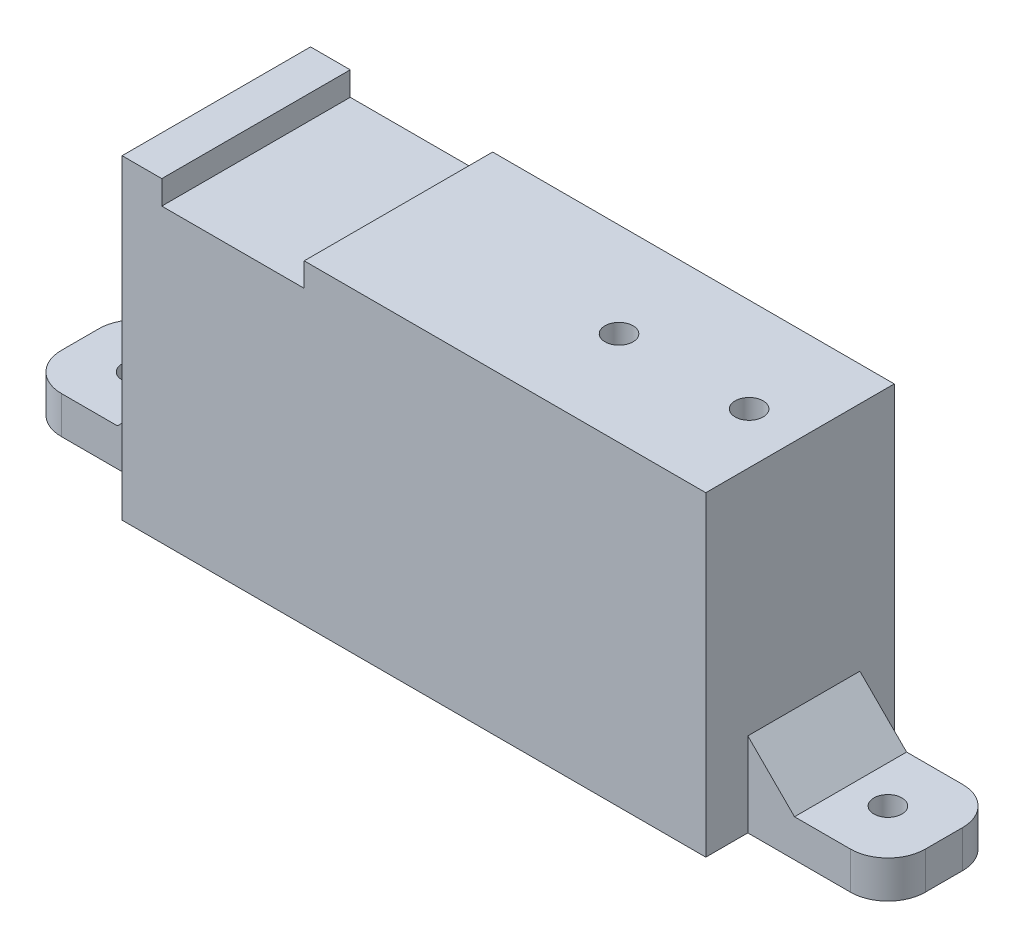
ISO-10303-21;
HEADER;
FILE_DESCRIPTION(('STEP AP214'),'2;1');
FILE_NAME('part.step','',(''),(''),'','','');
FILE_SCHEMA(('AUTOMOTIVE_DESIGN { 1 0 10303 214 1 1 1 1 }'));
ENDSEC;
DATA;
#1=APPLICATION_CONTEXT('core data for automotive mechanical design processes');
#2=APPLICATION_PROTOCOL_DEFINITION('international standard','automotive_design',2000,#1);
#3=PRODUCT_CONTEXT('',#1,'mechanical');
#4=PRODUCT('Part','Part','',(#3));
#5=PRODUCT_RELATED_PRODUCT_CATEGORY('part','',(#4));
#6=PRODUCT_DEFINITION_FORMATION('','',#4);
#7=PRODUCT_DEFINITION_CONTEXT('part definition',#1,'design');
#8=PRODUCT_DEFINITION('design','',#6,#7);
#9=PRODUCT_DEFINITION_SHAPE('','',#8);
#10=(LENGTH_UNIT() NAMED_UNIT(*) SI_UNIT(.MILLI.,.METRE.));
#11=(NAMED_UNIT(*) PLANE_ANGLE_UNIT() SI_UNIT($,.RADIAN.));
#12=(NAMED_UNIT(*) SI_UNIT($,.STERADIAN.) SOLID_ANGLE_UNIT());
#13=UNCERTAINTY_MEASURE_WITH_UNIT(LENGTH_MEASURE(1.E-05),#10,'distance_accuracy_value','');
#14=(GEOMETRIC_REPRESENTATION_CONTEXT(3) GLOBAL_UNCERTAINTY_ASSIGNED_CONTEXT((#13)) GLOBAL_UNIT_ASSIGNED_CONTEXT((#10,
#11,#12)) REPRESENTATION_CONTEXT('',''));
#15=CARTESIAN_POINT('',(0.,0.,0.));
#16=DIRECTION('',(0.,0.,1.));
#17=DIRECTION('',(1.,0.,0.));
#18=AXIS2_PLACEMENT_3D('',#15,#16,#17);
#19=CARTESIAN_POINT('',(31.25,33.8,10.09));
#20=DIRECTION('',(-1.,0.,0.));
#21=DIRECTION('',(0.,0.,1.));
#22=AXIS2_PLACEMENT_3D('',#19,#20,#21);
#23=PLANE('',#22);
#24=DIRECTION('',(0.,0.,-1.));
#25=VECTOR('',#24,1.);
#26=CARTESIAN_POINT('',(31.25,9.00000000000005,-6.41));
#27=LINE('',#26,#25);
#28=CARTESIAN_POINT('',(31.25,9.00000000000005,5.59));
#29=VERTEX_POINT('',#28);
#30=CARTESIAN_POINT('',(31.25,9.00000000000005,-6.41));
#31=VERTEX_POINT('',#30);
#32=EDGE_CURVE('E451',#29,#31,#27,.T.);
#33=ORIENTED_EDGE('',*,*,#32,.T.);
#34=DIRECTION('',(0.,-1.,0.));
#35=VECTOR('',#34,1.);
#36=CARTESIAN_POINT('',(31.25,4.,-6.41));
#37=LINE('',#36,#35);
#38=CARTESIAN_POINT('',(31.25,0.,-6.41));
#39=VERTEX_POINT('',#38);
#40=EDGE_CURVE('E272',#31,#39,#37,.T.);
#41=ORIENTED_EDGE('',*,*,#40,.T.);
#42=DIRECTION('',(0.,0.,-1.));
#43=VECTOR('',#42,1.);
#44=CARTESIAN_POINT('',(31.25,0.,10.09));
#45=LINE('',#44,#43);
#46=CARTESIAN_POINT('',(31.25,0.,-10.09));
#47=VERTEX_POINT('',#46);
#48=EDGE_CURVE('E379',#39,#47,#45,.T.);
#49=ORIENTED_EDGE('',*,*,#48,.T.);
#50=DIRECTION('',(0.,-1.,0.));
#51=VECTOR('',#50,1.);
#52=CARTESIAN_POINT('',(31.25,33.8,-10.09));
#53=LINE('',#52,#51);
#54=CARTESIAN_POINT('',(31.25,33.8,-10.09));
#55=VERTEX_POINT('',#54);
#56=EDGE_CURVE('E434',#55,#47,#53,.T.);
#57=ORIENTED_EDGE('',*,*,#56,.F.);
#58=DIRECTION('',(0.,0.,-1.));
#59=VECTOR('',#58,1.);
#60=CARTESIAN_POINT('',(31.25,33.8,10.09));
#61=LINE('',#60,#59);
#62=CARTESIAN_POINT('',(31.25,33.8,10.09));
#63=VERTEX_POINT('',#62);
#64=EDGE_CURVE('E390',#63,#55,#61,.T.);
#65=ORIENTED_EDGE('',*,*,#64,.F.);
#66=DIRECTION('',(0.,-1.,0.));
#67=VECTOR('',#66,1.);
#68=CARTESIAN_POINT('',(31.25,33.8,10.09));
#69=LINE('',#68,#67);
#70=CARTESIAN_POINT('',(31.25,0.,10.09));
#71=VERTEX_POINT('',#70);
#72=EDGE_CURVE('E408',#63,#71,#69,.T.);
#73=ORIENTED_EDGE('',*,*,#72,.T.);
#74=CARTESIAN_POINT('',(31.25,0.,5.59));
#75=VERTEX_POINT('',#74);
#76=EDGE_CURVE('E409',#71,#75,#45,.T.);
#77=ORIENTED_EDGE('',*,*,#76,.T.);
#78=DIRECTION('',(0.,-1.,0.));
#79=VECTOR('',#78,1.);
#80=CARTESIAN_POINT('',(31.25,4.,5.59));
#81=LINE('',#80,#79);
#82=EDGE_CURVE('E289',#29,#75,#81,.T.);
#83=ORIENTED_EDGE('',*,*,#82,.F.);
#84=EDGE_LOOP('',(#33,#41,#49,#57,#65,#73,#77,#83));
#85=FACE_BOUND('',#84,.T.);
#86=ADVANCED_FACE('F47',(#85),#23,.F.);
#87=CARTESIAN_POINT('',(-31.25,33.8,10.09));
#88=DIRECTION('',(1.,0.,0.));
#89=DIRECTION('',(0.,0.,-1.));
#90=AXIS2_PLACEMENT_3D('',#87,#88,#89);
#91=PLANE('',#90);
#92=DIRECTION('',(0.,0.,1.));
#93=VECTOR('',#92,1.);
#94=CARTESIAN_POINT('',(-31.25,9.00000000000005,5.59));
#95=LINE('',#94,#93);
#96=CARTESIAN_POINT('',(-31.25,9.00000000000005,-6.41));
#97=VERTEX_POINT('',#96);
#98=CARTESIAN_POINT('',(-31.25,9.00000000000005,5.59));
#99=VERTEX_POINT('',#98);
#100=EDGE_CURVE('E438',#97,#99,#95,.T.);
#101=ORIENTED_EDGE('',*,*,#100,.T.);
#102=DIRECTION('',(0.,-1.,0.));
#103=VECTOR('',#102,1.);
#104=CARTESIAN_POINT('',(-31.25,4.,5.59));
#105=LINE('',#104,#103);
#106=CARTESIAN_POINT('',(-31.25,0.,5.59));
#107=VERTEX_POINT('',#106);
#108=EDGE_CURVE('E219',#99,#107,#105,.T.);
#109=ORIENTED_EDGE('',*,*,#108,.T.);
#110=DIRECTION('',(0.,0.,1.));
#111=VECTOR('',#110,1.);
#112=CARTESIAN_POINT('',(-31.25,0.,10.09));
#113=LINE('',#112,#111);
#114=CARTESIAN_POINT('',(-31.25,0.,10.09));
#115=VERTEX_POINT('',#114);
#116=EDGE_CURVE('E416',#107,#115,#113,.T.);
#117=ORIENTED_EDGE('',*,*,#116,.T.);
#118=DIRECTION('',(0.,-1.,0.));
#119=VECTOR('',#118,1.);
#120=CARTESIAN_POINT('',(-31.25,33.8,10.09));
#121=LINE('',#120,#119);
#122=CARTESIAN_POINT('',(-31.25,33.8,10.09));
#123=VERTEX_POINT('',#122);
#124=EDGE_CURVE('E426',#123,#115,#121,.T.);
#125=ORIENTED_EDGE('',*,*,#124,.F.);
#126=DIRECTION('',(0.,0.,1.));
#127=VECTOR('',#126,1.);
#128=CARTESIAN_POINT('',(-31.25,33.8,10.09));
#129=LINE('',#128,#127);
#130=CARTESIAN_POINT('',(-31.25,33.8,-10.09));
#131=VERTEX_POINT('',#130);
#132=EDGE_CURVE('E400',#131,#123,#129,.T.);
#133=ORIENTED_EDGE('',*,*,#132,.F.);
#134=DIRECTION('',(0.,-1.,0.));
#135=VECTOR('',#134,1.);
#136=CARTESIAN_POINT('',(-31.25,33.8,-10.09));
#137=LINE('',#136,#135);
#138=CARTESIAN_POINT('',(-31.25,0.,-10.09));
#139=VERTEX_POINT('',#138);
#140=EDGE_CURVE('E430',#131,#139,#137,.T.);
#141=ORIENTED_EDGE('',*,*,#140,.T.);
#142=CARTESIAN_POINT('',(-31.25,0.,-6.41));
#143=VERTEX_POINT('',#142);
#144=EDGE_CURVE('E417',#139,#143,#113,.T.);
#145=ORIENTED_EDGE('',*,*,#144,.T.);
#146=DIRECTION('',(0.,-1.,0.));
#147=VECTOR('',#146,1.);
#148=CARTESIAN_POINT('',(-31.25,4.,-6.41));
#149=LINE('',#148,#147);
#150=EDGE_CURVE('E257',#97,#143,#149,.T.);
#151=ORIENTED_EDGE('',*,*,#150,.F.);
#152=EDGE_LOOP('',(#101,#109,#117,#125,#133,#141,#145,#151));
#153=FACE_BOUND('',#152,.T.);
#154=ADVANCED_FACE('F500',(#153),#91,.F.);
#155=CARTESIAN_POINT('',(0.,33.8,0.));
#156=DIRECTION('',(0.,-1.,0.));
#157=DIRECTION('',(0.,0.,-1.));
#158=AXIS2_PLACEMENT_3D('',#155,#156,#157);
#159=PLANE('',#158);
#160=DIRECTION('',(1.,0.,0.));
#161=VECTOR('',#160,1.);
#162=CARTESIAN_POINT('',(-31.25,33.8,10.09));
#163=LINE('',#162,#161);
#164=CARTESIAN_POINT('',(-27.,33.8,10.09));
#165=VERTEX_POINT('',#164);
#166=EDGE_CURVE('E404',#123,#165,#163,.T.);
#167=ORIENTED_EDGE('',*,*,#166,.T.);
#168=DIRECTION('',(0.,0.,1.));
#169=VECTOR('',#168,1.);
#170=CARTESIAN_POINT('',(-27.,33.8,-10.09));
#171=LINE('',#170,#169);
#172=CARTESIAN_POINT('',(-27.,33.8,-10.09));
#173=VERTEX_POINT('',#172);
#174=EDGE_CURVE('E342',#173,#165,#171,.T.);
#175=ORIENTED_EDGE('',*,*,#174,.F.);
#176=DIRECTION('',(-1.,0.,0.));
#177=VECTOR('',#176,1.);
#178=CARTESIAN_POINT('',(-31.25,33.8,-10.09));
#179=LINE('',#178,#177);
#180=EDGE_CURVE('E394',#173,#131,#179,.T.);
#181=ORIENTED_EDGE('',*,*,#180,.T.);
#182=ORIENTED_EDGE('',*,*,#132,.T.);
#183=EDGE_LOOP('',(#167,#175,#181,#182));
#184=FACE_BOUND('',#183,.T.);
#185=ADVANCED_FACE('F506',(#184),#159,.F.);
#186=CARTESIAN_POINT('',(-31.25,33.8,-10.09));
#187=DIRECTION('',(0.,0.,1.));
#188=DIRECTION('',(1.,0.,0.));
#189=AXIS2_PLACEMENT_3D('',#186,#187,#188);
#190=PLANE('',#189);
#191=ORIENTED_EDGE('',*,*,#180,.F.);
#192=DIRECTION('',(0.,1.,0.));
#193=VECTOR('',#192,1.);
#194=CARTESIAN_POINT('',(-27.,31.25,-10.09));
#195=LINE('',#194,#193);
#196=CARTESIAN_POINT('',(-27.,31.25,-10.09));
#197=VERTEX_POINT('',#196);
#198=EDGE_CURVE('E376',#197,#173,#195,.T.);
#199=ORIENTED_EDGE('',*,*,#198,.F.);
#200=DIRECTION('',(-1.,0.,0.));
#201=VECTOR('',#200,1.);
#202=CARTESIAN_POINT('',(-27.,31.25,-10.09));
#203=LINE('',#202,#201);
#204=CARTESIAN_POINT('',(-11.75,31.25,-10.09));
#205=VERTEX_POINT('',#204);
#206=EDGE_CURVE('E367',#205,#197,#203,.T.);
#207=ORIENTED_EDGE('',*,*,#206,.F.);
#208=DIRECTION('',(0.,1.,0.));
#209=VECTOR('',#208,1.);
#210=CARTESIAN_POINT('',(-11.75,31.25,-10.09));
#211=LINE('',#210,#209);
#212=CARTESIAN_POINT('',(-11.75,33.8,-10.09));
#213=VERTEX_POINT('',#212);
#214=EDGE_CURVE('E380',#205,#213,#211,.T.);
#215=ORIENTED_EDGE('',*,*,#214,.T.);
#216=EDGE_CURVE('E396',#55,#213,#179,.T.);
#217=ORIENTED_EDGE('',*,*,#216,.F.);
#218=ORIENTED_EDGE('',*,*,#56,.T.);
#219=DIRECTION('',(-1.,0.,0.));
#220=VECTOR('',#219,1.);
#221=CARTESIAN_POINT('',(-31.25,0.,-10.09));
#222=LINE('',#221,#220);
#223=EDGE_CURVE('E413',#47,#139,#222,.T.);
#224=ORIENTED_EDGE('',*,*,#223,.T.);
#225=ORIENTED_EDGE('',*,*,#140,.F.);
#226=EDGE_LOOP('',(#191,#199,#207,#215,#217,#218,#224,#225));
#227=FACE_BOUND('',#226,.T.);
#228=ADVANCED_FACE('F474',(#227),#190,.F.);
#229=CARTESIAN_POINT('',(-31.25,33.8,10.09));
#230=DIRECTION('',(0.,0.,-1.));
#231=DIRECTION('',(-1.,0.,0.));
#232=AXIS2_PLACEMENT_3D('',#229,#230,#231);
#233=PLANE('',#232);
#234=DIRECTION('',(1.,0.,0.));
#235=VECTOR('',#234,1.);
#236=CARTESIAN_POINT('',(-27.,31.25,10.09));
#237=LINE('',#236,#235);
#238=CARTESIAN_POINT('',(-27.,31.25,10.09));
#239=VERTEX_POINT('',#238);
#240=CARTESIAN_POINT('',(-11.75,31.25,10.09));
#241=VERTEX_POINT('',#240);
#242=EDGE_CURVE('E358',#239,#241,#237,.T.);
#243=ORIENTED_EDGE('',*,*,#242,.F.);
#244=DIRECTION('',(0.,1.,0.));
#245=VECTOR('',#244,1.);
#246=CARTESIAN_POINT('',(-27.,31.25,10.09));
#247=LINE('',#246,#245);
#248=EDGE_CURVE('E371',#239,#165,#247,.T.);
#249=ORIENTED_EDGE('',*,*,#248,.T.);
#250=ORIENTED_EDGE('',*,*,#166,.F.);
#251=ORIENTED_EDGE('',*,*,#124,.T.);
#252=DIRECTION('',(1.,0.,0.));
#253=VECTOR('',#252,1.);
#254=CARTESIAN_POINT('',(-31.25,0.,10.09));
#255=LINE('',#254,#253);
#256=EDGE_CURVE('E395',#115,#71,#255,.T.);
#257=ORIENTED_EDGE('',*,*,#256,.T.);
#258=ORIENTED_EDGE('',*,*,#72,.F.);
#259=CARTESIAN_POINT('',(-11.75,33.8,10.09));
#260=VERTEX_POINT('',#259);
#261=EDGE_CURVE('E403',#260,#63,#163,.T.);
#262=ORIENTED_EDGE('',*,*,#261,.F.);
#263=DIRECTION('',(0.,1.,0.));
#264=VECTOR('',#263,1.);
#265=CARTESIAN_POINT('',(-11.75,31.25,10.09));
#266=LINE('',#265,#264);
#267=EDGE_CURVE('E384',#241,#260,#266,.T.);
#268=ORIENTED_EDGE('',*,*,#267,.F.);
#269=EDGE_LOOP('',(#243,#249,#250,#251,#257,#258,#262,#268));
#270=FACE_BOUND('',#269,.T.);
#271=ADVANCED_FACE('F516',(#270),#233,.F.);
#272=CARTESIAN_POINT('',(25.8,33.8,0.));
#273=DIRECTION('',(0.,1.,0.));
#274=DIRECTION('',(0.,0.,1.));
#275=AXIS2_PLACEMENT_3D('',#272,#273,#274);
#276=CIRCLE('',#275,1.5);
#277=CARTESIAN_POINT('',(25.8,33.8,1.5));
#278=VERTEX_POINT('',#277);
#279=EDGE_CURVE('E343',#278,#278,#276,.T.);
#280=ORIENTED_EDGE('',*,*,#279,.F.);
#281=EDGE_LOOP('',(#280));
#282=FACE_BOUND('',#281,.T.);
#283=CARTESIAN_POINT('',(11.87,33.8,0.));
#284=DIRECTION('',(0.,1.,0.));
#285=DIRECTION('',(0.,0.,1.));
#286=AXIS2_PLACEMENT_3D('',#283,#284,#285);
#287=CIRCLE('',#286,1.5);
#288=CARTESIAN_POINT('',(11.87,33.8,1.5));
#289=VERTEX_POINT('',#288);
#290=EDGE_CURVE('E347',#289,#289,#287,.T.);
#291=ORIENTED_EDGE('',*,*,#290,.F.);
#292=EDGE_LOOP('',(#291));
#293=FACE_BOUND('',#292,.T.);
#294=ORIENTED_EDGE('',*,*,#216,.T.);
#295=DIRECTION('',(0.,0.,-1.));
#296=VECTOR('',#295,1.);
#297=CARTESIAN_POINT('',(-11.75,33.8,-10.09));
#298=LINE('',#297,#296);
#299=EDGE_CURVE('E359',#260,#213,#298,.T.);
#300=ORIENTED_EDGE('',*,*,#299,.F.);
#301=ORIENTED_EDGE('',*,*,#261,.T.);
#302=ORIENTED_EDGE('',*,*,#64,.T.);
#303=EDGE_LOOP('',(#294,#300,#301,#302));
#304=FACE_BOUND('',#303,.T.);
#305=ADVANCED_FACE('F478',(#282,#293,#304),#159,.F.);
#306=CARTESIAN_POINT('',(0.,0.,0.));
#307=DIRECTION('',(0.,-1.,0.));
#308=DIRECTION('',(0.,0.,-1.));
#309=AXIS2_PLACEMENT_3D('',#306,#307,#308);
#310=PLANE('',#309);
#311=ORIENTED_EDGE('',*,*,#76,.F.);
#312=ORIENTED_EDGE('',*,*,#256,.F.);
#313=ORIENTED_EDGE('',*,*,#116,.F.);
#314=DIRECTION('',(-1.,0.,0.));
#315=VECTOR('',#314,1.);
#316=CARTESIAN_POINT('',(-31.25,0.,5.59));
#317=LINE('',#316,#315);
#318=CARTESIAN_POINT('',(-42.25,0.,5.59));
#319=VERTEX_POINT('',#318);
#320=EDGE_CURVE('E240',#107,#319,#317,.T.);
#321=ORIENTED_EDGE('',*,*,#320,.T.);
#322=CARTESIAN_POINT('',(-42.25,0.,1.59));
#323=DIRECTION('',(0.,-1.,0.));
#324=DIRECTION('',(0.,0.,1.));
#325=AXIS2_PLACEMENT_3D('',#322,#323,#324);
#326=CIRCLE('',#325,4.);
#327=CARTESIAN_POINT('',(-46.25,0.,1.58999999999997));
#328=VERTEX_POINT('',#327);
#329=EDGE_CURVE('E215',#319,#328,#326,.T.);
#330=ORIENTED_EDGE('',*,*,#329,.T.);
#331=DIRECTION('',(0.,0.,-1.));
#332=VECTOR('',#331,1.);
#333=CARTESIAN_POINT('',(-46.25,0.,1.58999999999997));
#334=LINE('',#333,#332);
#335=CARTESIAN_POINT('',(-46.25,0.,-2.40999999999997));
#336=VERTEX_POINT('',#335);
#337=EDGE_CURVE('E246',#328,#336,#334,.T.);
#338=ORIENTED_EDGE('',*,*,#337,.T.);
#339=CARTESIAN_POINT('',(-42.25,0.,-2.41));
#340=DIRECTION('',(0.,-1.,0.));
#341=DIRECTION('',(0.,0.,-1.));
#342=AXIS2_PLACEMENT_3D('',#339,#340,#341);
#343=CIRCLE('',#342,4.);
#344=CARTESIAN_POINT('',(-42.25,0.,-6.41));
#345=VERTEX_POINT('',#344);
#346=EDGE_CURVE('E250',#336,#345,#343,.T.);
#347=ORIENTED_EDGE('',*,*,#346,.T.);
#348=DIRECTION('',(1.,0.,0.));
#349=VECTOR('',#348,1.);
#350=CARTESIAN_POINT('',(-31.25,0.,-6.41));
#351=LINE('',#350,#349);
#352=EDGE_CURVE('E209',#345,#143,#351,.T.);
#353=ORIENTED_EDGE('',*,*,#352,.T.);
#354=ORIENTED_EDGE('',*,*,#144,.F.);
#355=ORIENTED_EDGE('',*,*,#223,.F.);
#356=ORIENTED_EDGE('',*,*,#48,.F.);
#357=DIRECTION('',(1.,0.,0.));
#358=VECTOR('',#357,1.);
#359=CARTESIAN_POINT('',(31.25,0.,-6.41));
#360=LINE('',#359,#358);
#361=CARTESIAN_POINT('',(42.25,0.,-6.41));
#362=VERTEX_POINT('',#361);
#363=EDGE_CURVE('E309',#39,#362,#360,.T.);
#364=ORIENTED_EDGE('',*,*,#363,.T.);
#365=CARTESIAN_POINT('',(42.25,0.,-2.41));
#366=DIRECTION('',(0.,-1.,0.));
#367=DIRECTION('',(0.,0.,-1.));
#368=AXIS2_PLACEMENT_3D('',#365,#366,#367);
#369=CIRCLE('',#368,4.);
#370=CARTESIAN_POINT('',(46.25,0.,-2.40999999999997));
#371=VERTEX_POINT('',#370);
#372=EDGE_CURVE('E305',#362,#371,#369,.T.);
#373=ORIENTED_EDGE('',*,*,#372,.T.);
#374=DIRECTION('',(0.,0.,1.));
#375=VECTOR('',#374,1.);
#376=CARTESIAN_POINT('',(46.25,0.,1.58999999999997));
#377=LINE('',#376,#375);
#378=CARTESIAN_POINT('',(46.25,0.,1.58999999999997));
#379=VERTEX_POINT('',#378);
#380=EDGE_CURVE('E301',#371,#379,#377,.T.);
#381=ORIENTED_EDGE('',*,*,#380,.T.);
#382=CARTESIAN_POINT('',(42.25,0.,1.59));
#383=DIRECTION('',(0.,-1.,0.));
#384=DIRECTION('',(0.,0.,-1.));
#385=AXIS2_PLACEMENT_3D('',#382,#383,#384);
#386=CIRCLE('',#385,4.);
#387=CARTESIAN_POINT('',(42.25,0.,5.59));
#388=VERTEX_POINT('',#387);
#389=EDGE_CURVE('E296',#379,#388,#386,.T.);
#390=ORIENTED_EDGE('',*,*,#389,.T.);
#391=DIRECTION('',(-1.,0.,0.));
#392=VECTOR('',#391,1.);
#393=CARTESIAN_POINT('',(31.25,0.,5.59));
#394=LINE('',#393,#392);
#395=EDGE_CURVE('E292',#388,#75,#394,.T.);
#396=ORIENTED_EDGE('',*,*,#395,.T.);
#397=EDGE_LOOP('',(#311,#312,#313,#321,#330,#338,#347,#353,#354,#355,#356,#364,#373,#381,#390,#396));
#398=FACE_BOUND('',#397,.T.);
#399=CARTESIAN_POINT('',(-40.25,0.,-0.41));
#400=DIRECTION('',(0.,-1.,0.));
#401=DIRECTION('',(0.,0.,-1.));
#402=AXIS2_PLACEMENT_3D('',#399,#400,#401);
#403=CIRCLE('',#402,1.5);
#404=CARTESIAN_POINT('',(-40.25,0.,-1.91));
#405=VERTEX_POINT('',#404);
#406=EDGE_CURVE('E334',#405,#405,#403,.T.);
#407=ORIENTED_EDGE('',*,*,#406,.F.);
#408=EDGE_LOOP('',(#407));
#409=FACE_BOUND('',#408,.T.);
#410=CARTESIAN_POINT('',(40.25,0.,-0.41));
#411=DIRECTION('',(0.,-1.,0.));
#412=DIRECTION('',(0.,0.,1.));
#413=AXIS2_PLACEMENT_3D('',#410,#411,#412);
#414=CIRCLE('',#413,1.5);
#415=CARTESIAN_POINT('',(40.25,0.,1.09));
#416=VERTEX_POINT('',#415);
#417=EDGE_CURVE('E330',#416,#416,#414,.T.);
#418=ORIENTED_EDGE('',*,*,#417,.F.);
#419=EDGE_LOOP('',(#418));
#420=FACE_BOUND('',#419,.T.);
#421=ADVANCED_FACE('F469',(#398,#409,#420),#310,.T.);
#422=CARTESIAN_POINT('',(-27.,31.25,-10.09));
#423=DIRECTION('',(-1.,0.,0.));
#424=DIRECTION('',(0.,0.,1.));
#425=AXIS2_PLACEMENT_3D('',#422,#423,#424);
#426=PLANE('',#425);
#427=ORIENTED_EDGE('',*,*,#174,.T.);
#428=ORIENTED_EDGE('',*,*,#248,.F.);
#429=DIRECTION('',(0.,0.,1.));
#430=VECTOR('',#429,1.);
#431=CARTESIAN_POINT('',(-27.,31.25,-10.09));
#432=LINE('',#431,#430);
#433=EDGE_CURVE('E354',#197,#239,#432,.T.);
#434=ORIENTED_EDGE('',*,*,#433,.F.);
#435=ORIENTED_EDGE('',*,*,#198,.T.);
#436=EDGE_LOOP('',(#427,#428,#434,#435));
#437=FACE_BOUND('',#436,.T.);
#438=ADVANCED_FACE('F522',(#437),#426,.F.);
#439=CARTESIAN_POINT('',(-11.75,31.25,-10.09));
#440=DIRECTION('',(1.,0.,0.));
#441=DIRECTION('',(0.,0.,-1.));
#442=AXIS2_PLACEMENT_3D('',#439,#440,#441);
#443=PLANE('',#442);
#444=ORIENTED_EDGE('',*,*,#299,.T.);
#445=ORIENTED_EDGE('',*,*,#214,.F.);
#446=DIRECTION('',(0.,0.,-1.));
#447=VECTOR('',#446,1.);
#448=CARTESIAN_POINT('',(-11.75,31.25,-10.09));
#449=LINE('',#448,#447);
#450=EDGE_CURVE('E363',#241,#205,#449,.T.);
#451=ORIENTED_EDGE('',*,*,#450,.F.);
#452=ORIENTED_EDGE('',*,*,#267,.T.);
#453=EDGE_LOOP('',(#444,#445,#451,#452));
#454=FACE_BOUND('',#453,.T.);
#455=ADVANCED_FACE('F528',(#454),#443,.F.);
#456=CARTESIAN_POINT('',(0.,31.25,0.));
#457=DIRECTION('',(0.,1.,0.));
#458=DIRECTION('',(0.,0.,1.));
#459=AXIS2_PLACEMENT_3D('',#456,#457,#458);
#460=PLANE('',#459);
#461=ORIENTED_EDGE('',*,*,#433,.T.);
#462=ORIENTED_EDGE('',*,*,#242,.T.);
#463=ORIENTED_EDGE('',*,*,#450,.T.);
#464=ORIENTED_EDGE('',*,*,#206,.T.);
#465=EDGE_LOOP('',(#461,#462,#463,#464));
#466=FACE_BOUND('',#465,.T.);
#467=ADVANCED_FACE('F532',(#466),#460,.T.);
#468=CARTESIAN_POINT('',(11.87,18.8,0.));
#469=DIRECTION('',(0.,1.,0.));
#470=DIRECTION('',(0.,0.,1.));
#471=AXIS2_PLACEMENT_3D('',#468,#469,#470);
#472=CYLINDRICAL_SURFACE('',#471,1.5);
#473=CARTESIAN_POINT('',(11.87,18.8,0.));
#474=DIRECTION('',(0.,1.,0.));
#475=DIRECTION('',(0.,0.,1.));
#476=AXIS2_PLACEMENT_3D('',#473,#474,#475);
#477=CIRCLE('',#476,1.5);
#478=CARTESIAN_POINT('',(11.87,18.8,1.5));
#479=VERTEX_POINT('',#478);
#480=EDGE_CURVE('E260',#479,#479,#477,.T.);
#481=ORIENTED_EDGE('',*,*,#480,.F.);
#482=EDGE_LOOP('',(#481));
#483=FACE_BOUND('',#482,.T.);
#484=ORIENTED_EDGE('',*,*,#290,.T.);
#485=EDGE_LOOP('',(#484));
#486=FACE_BOUND('',#485,.T.);
#487=ADVANCED_FACE('F536',(#483,#486),#472,.F.);
#488=CARTESIAN_POINT('',(11.87,18.8,0.));
#489=DIRECTION('',(0.,1.,0.));
#490=DIRECTION('',(0.,0.,1.));
#491=AXIS2_PLACEMENT_3D('',#488,#489,#490);
#492=PLANE('',#491);
#493=ORIENTED_EDGE('',*,*,#480,.T.);
#494=EDGE_LOOP('',(#493));
#495=FACE_BOUND('',#494,.T.);
#496=ADVANCED_FACE('F538',(#495),#492,.T.);
#497=CARTESIAN_POINT('',(25.8,18.8,0.));
#498=DIRECTION('',(0.,1.,0.));
#499=DIRECTION('',(0.,0.,1.));
#500=AXIS2_PLACEMENT_3D('',#497,#498,#499);
#501=CYLINDRICAL_SURFACE('',#500,1.5);
#502=CARTESIAN_POINT('',(25.8,18.8,0.));
#503=DIRECTION('',(0.,1.,0.));
#504=DIRECTION('',(0.,0.,1.));
#505=AXIS2_PLACEMENT_3D('',#502,#503,#504);
#506=CIRCLE('',#505,1.5);
#507=CARTESIAN_POINT('',(25.8,18.8,1.5));
#508=VERTEX_POINT('',#507);
#509=EDGE_CURVE('E338',#508,#508,#506,.T.);
#510=ORIENTED_EDGE('',*,*,#509,.F.);
#511=EDGE_LOOP('',(#510));
#512=FACE_BOUND('',#511,.T.);
#513=ORIENTED_EDGE('',*,*,#279,.T.);
#514=EDGE_LOOP('',(#513));
#515=FACE_BOUND('',#514,.T.);
#516=ADVANCED_FACE('F541',(#512,#515),#501,.F.);
#517=CARTESIAN_POINT('',(0.,18.8,0.));
#518=DIRECTION('',(0.,1.,0.));
#519=DIRECTION('',(0.,0.,1.));
#520=AXIS2_PLACEMENT_3D('',#517,#518,#519);
#521=PLANE('',#520);
#522=ORIENTED_EDGE('',*,*,#509,.T.);
#523=EDGE_LOOP('',(#522));
#524=FACE_BOUND('',#523,.T.);
#525=ADVANCED_FACE('F548',(#524),#521,.T.);
#526=CARTESIAN_POINT('',(-31.25,4.,-6.41));
#527=DIRECTION('',(0.,0.,-1.));
#528=DIRECTION('',(-1.,0.,0.));
#529=AXIS2_PLACEMENT_3D('',#526,#527,#528);
#530=PLANE('',#529);
#531=ORIENTED_EDGE('',*,*,#352,.F.);
#532=DIRECTION('',(0.,-1.,0.));
#533=VECTOR('',#532,1.);
#534=CARTESIAN_POINT('',(-42.25,4.,-6.41));
#535=LINE('',#534,#533);
#536=CARTESIAN_POINT('',(-42.25,4.,-6.41));
#537=VERTEX_POINT('',#536);
#538=EDGE_CURVE('E261',#537,#345,#535,.T.);
#539=ORIENTED_EDGE('',*,*,#538,.F.);
#540=DIRECTION('',(1.,0.,0.));
#541=VECTOR('',#540,1.);
#542=CARTESIAN_POINT('',(-31.25,4.,-6.41));
#543=LINE('',#542,#541);
#544=CARTESIAN_POINT('',(-36.25,4.,-6.41));
#545=VERTEX_POINT('',#544);
#546=EDGE_CURVE('E236',#537,#545,#543,.T.);
#547=ORIENTED_EDGE('',*,*,#546,.T.);
#548=DIRECTION('',(-0.707106781186544,-0.707106781186551,0.));
#549=VECTOR('',#548,1.);
#550=CARTESIAN_POINT('',(-31.25,9.00000000000005,-6.41));
#551=LINE('',#550,#549);
#552=EDGE_CURVE('E447',#545,#97,#551,.F.);
#553=ORIENTED_EDGE('',*,*,#552,.T.);
#554=ORIENTED_EDGE('',*,*,#150,.T.);
#555=EDGE_LOOP('',(#531,#539,#547,#553,#554));
#556=FACE_BOUND('',#555,.T.);
#557=ADVANCED_FACE('F552',(#556),#530,.T.);
#558=CARTESIAN_POINT('',(-42.25,4.,-2.41));
#559=DIRECTION('',(0.,-1.,0.));
#560=DIRECTION('',(0.,0.,-1.));
#561=AXIS2_PLACEMENT_3D('',#558,#559,#560);
#562=CYLINDRICAL_SURFACE('',#561,4.);
#563=ORIENTED_EDGE('',*,*,#346,.F.);
#564=DIRECTION('',(0.,-1.,0.));
#565=VECTOR('',#564,1.);
#566=CARTESIAN_POINT('',(-46.25,4.,-2.40999999999997));
#567=LINE('',#566,#565);
#568=CARTESIAN_POINT('',(-46.25,4.,-2.40999999999997));
#569=VERTEX_POINT('',#568);
#570=EDGE_CURVE('E264',#569,#336,#567,.T.);
#571=ORIENTED_EDGE('',*,*,#570,.F.);
#572=CARTESIAN_POINT('',(-42.25,4.,-2.41));
#573=DIRECTION('',(0.,-1.,0.));
#574=DIRECTION('',(0.,0.,-1.));
#575=AXIS2_PLACEMENT_3D('',#572,#573,#574);
#576=CIRCLE('',#575,4.);
#577=EDGE_CURVE('E229',#569,#537,#576,.T.);
#578=ORIENTED_EDGE('',*,*,#577,.T.);
#579=ORIENTED_EDGE('',*,*,#538,.T.);
#580=EDGE_LOOP('',(#563,#571,#578,#579));
#581=FACE_BOUND('',#580,.T.);
#582=ADVANCED_FACE('F584',(#581),#562,.T.);
#583=CARTESIAN_POINT('',(-46.25,4.,1.58999999999997));
#584=DIRECTION('',(-1.,0.,0.));
#585=DIRECTION('',(0.,0.,1.));
#586=AXIS2_PLACEMENT_3D('',#583,#584,#585);
#587=PLANE('',#586);
#588=ORIENTED_EDGE('',*,*,#337,.F.);
#589=DIRECTION('',(0.,-1.,0.));
#590=VECTOR('',#589,1.);
#591=CARTESIAN_POINT('',(-46.25,4.,1.58999999999997));
#592=LINE('',#591,#590);
#593=CARTESIAN_POINT('',(-46.25,4.,1.58999999999997));
#594=VERTEX_POINT('',#593);
#595=EDGE_CURVE('E218',#594,#328,#592,.T.);
#596=ORIENTED_EDGE('',*,*,#595,.F.);
#597=DIRECTION('',(0.,0.,-1.));
#598=VECTOR('',#597,1.);
#599=CARTESIAN_POINT('',(-46.25,4.,1.58999999999997));
#600=LINE('',#599,#598);
#601=EDGE_CURVE('E225',#594,#569,#600,.T.);
#602=ORIENTED_EDGE('',*,*,#601,.T.);
#603=ORIENTED_EDGE('',*,*,#570,.T.);
#604=EDGE_LOOP('',(#588,#596,#602,#603));
#605=FACE_BOUND('',#604,.T.);
#606=ADVANCED_FACE('F581',(#605),#587,.T.);
#607=CARTESIAN_POINT('',(-42.25,4.,1.59));
#608=DIRECTION('',(0.,-1.,0.));
#609=DIRECTION('',(0.,0.,-1.));
#610=AXIS2_PLACEMENT_3D('',#607,#608,#609);
#611=CYLINDRICAL_SURFACE('',#610,4.);
#612=ORIENTED_EDGE('',*,*,#329,.F.);
#613=DIRECTION('',(0.,-1.,0.));
#614=VECTOR('',#613,1.);
#615=CARTESIAN_POINT('',(-42.25,4.,5.59));
#616=LINE('',#615,#614);
#617=CARTESIAN_POINT('',(-42.25,4.,5.59));
#618=VERTEX_POINT('',#617);
#619=EDGE_CURVE('E200',#618,#319,#616,.T.);
#620=ORIENTED_EDGE('',*,*,#619,.F.);
#621=CARTESIAN_POINT('',(-42.25,4.,1.59));
#622=DIRECTION('',(0.,-1.,0.));
#623=DIRECTION('',(0.,0.,1.));
#624=AXIS2_PLACEMENT_3D('',#621,#622,#623);
#625=CIRCLE('',#624,4.);
#626=EDGE_CURVE('E208',#618,#594,#625,.T.);
#627=ORIENTED_EDGE('',*,*,#626,.T.);
#628=ORIENTED_EDGE('',*,*,#595,.T.);
#629=EDGE_LOOP('',(#612,#620,#627,#628));
#630=FACE_BOUND('',#629,.T.);
#631=ADVANCED_FACE('F213',(#630),#611,.T.);
#632=CARTESIAN_POINT('',(-31.25,4.,5.59));
#633=DIRECTION('',(0.,0.,1.));
#634=DIRECTION('',(1.,0.,0.));
#635=AXIS2_PLACEMENT_3D('',#632,#633,#634);
#636=PLANE('',#635);
#637=ORIENTED_EDGE('',*,*,#320,.F.);
#638=ORIENTED_EDGE('',*,*,#108,.F.);
#639=DIRECTION('',(0.707106781186544,0.707106781186551,0.));
#640=VECTOR('',#639,1.);
#641=CARTESIAN_POINT('',(-31.25,9.00000000000005,5.59));
#642=LINE('',#641,#640);
#643=CARTESIAN_POINT('',(-36.25,4.,5.59));
#644=VERTEX_POINT('',#643);
#645=EDGE_CURVE('E203',#99,#644,#642,.F.);
#646=ORIENTED_EDGE('',*,*,#645,.T.);
#647=DIRECTION('',(-1.,0.,0.));
#648=VECTOR('',#647,1.);
#649=CARTESIAN_POINT('',(-31.25,4.,5.59));
#650=LINE('',#649,#648);
#651=EDGE_CURVE('E197',#644,#618,#650,.T.);
#652=ORIENTED_EDGE('',*,*,#651,.T.);
#653=ORIENTED_EDGE('',*,*,#619,.T.);
#654=EDGE_LOOP('',(#637,#638,#646,#652,#653));
#655=FACE_BOUND('',#654,.T.);
#656=ADVANCED_FACE('F199',(#655),#636,.T.);
#657=CARTESIAN_POINT('',(-42.25,4.,-2.41));
#658=DIRECTION('',(0.,-1.,0.));
#659=DIRECTION('',(0.,0.,-1.));
#660=AXIS2_PLACEMENT_3D('',#657,#658,#659);
#661=PLANE('',#660);
#662=CARTESIAN_POINT('',(-40.25,4.,-0.41));
#663=DIRECTION('',(0.,-1.,0.));
#664=DIRECTION('',(0.,0.,-1.));
#665=AXIS2_PLACEMENT_3D('',#662,#663,#664);
#666=CIRCLE('',#665,1.5);
#667=CARTESIAN_POINT('',(-40.25,4.,-1.91));
#668=VERTEX_POINT('',#667);
#669=EDGE_CURVE('E243',#668,#668,#666,.T.);
#670=ORIENTED_EDGE('',*,*,#669,.T.);
#671=EDGE_LOOP('',(#670));
#672=FACE_BOUND('',#671,.T.);
#673=ORIENTED_EDGE('',*,*,#651,.F.);
#674=DIRECTION('',(0.,0.,-1.));
#675=VECTOR('',#674,1.);
#676=CARTESIAN_POINT('',(-36.25,4.,-6.41));
#677=LINE('',#676,#675);
#678=EDGE_CURVE('E442',#644,#545,#677,.T.);
#679=ORIENTED_EDGE('',*,*,#678,.T.);
#680=ORIENTED_EDGE('',*,*,#546,.F.);
#681=ORIENTED_EDGE('',*,*,#577,.F.);
#682=ORIENTED_EDGE('',*,*,#601,.F.);
#683=ORIENTED_EDGE('',*,*,#626,.F.);
#684=EDGE_LOOP('',(#673,#679,#680,#681,#682,#683));
#685=FACE_BOUND('',#684,.T.);
#686=ADVANCED_FACE('F222',(#672,#685),#661,.F.);
#687=CARTESIAN_POINT('',(-40.25,4.,-0.41));
#688=DIRECTION('',(0.,-1.,0.));
#689=DIRECTION('',(0.,0.,-1.));
#690=AXIS2_PLACEMENT_3D('',#687,#688,#689);
#691=CYLINDRICAL_SURFACE('',#690,1.5);
#692=ORIENTED_EDGE('',*,*,#669,.F.);
#693=EDGE_LOOP('',(#692));
#694=FACE_BOUND('',#693,.T.);
#695=ORIENTED_EDGE('',*,*,#406,.T.);
#696=EDGE_LOOP('',(#695));
#697=FACE_BOUND('',#696,.T.);
#698=ADVANCED_FACE('F563',(#694,#697),#691,.F.);
#699=CARTESIAN_POINT('',(31.25,4.,5.59));
#700=DIRECTION('',(0.,0.,1.));
#701=DIRECTION('',(1.,0.,0.));
#702=AXIS2_PLACEMENT_3D('',#699,#700,#701);
#703=PLANE('',#702);
#704=ORIENTED_EDGE('',*,*,#395,.F.);
#705=DIRECTION('',(0.,-1.,0.));
#706=VECTOR('',#705,1.);
#707=CARTESIAN_POINT('',(42.25,4.,5.59));
#708=LINE('',#707,#706);
#709=CARTESIAN_POINT('',(42.25,4.,5.59));
#710=VERTEX_POINT('',#709);
#711=EDGE_CURVE('E286',#710,#388,#708,.T.);
#712=ORIENTED_EDGE('',*,*,#711,.F.);
#713=DIRECTION('',(-1.,0.,0.));
#714=VECTOR('',#713,1.);
#715=CARTESIAN_POINT('',(31.25,4.,5.59));
#716=LINE('',#715,#714);
#717=CARTESIAN_POINT('',(36.25,4.,5.59));
#718=VERTEX_POINT('',#717);
#719=EDGE_CURVE('E276',#710,#718,#716,.T.);
#720=ORIENTED_EDGE('',*,*,#719,.T.);
#721=DIRECTION('',(0.707106781186544,-0.707106781186551,0.));
#722=VECTOR('',#721,1.);
#723=CARTESIAN_POINT('',(31.25,9.00000000000005,5.59));
#724=LINE('',#723,#722);
#725=EDGE_CURVE('E11',#718,#29,#724,.F.);
#726=ORIENTED_EDGE('',*,*,#725,.T.);
#727=ORIENTED_EDGE('',*,*,#82,.T.);
#728=EDGE_LOOP('',(#704,#712,#720,#726,#727));
#729=FACE_BOUND('',#728,.T.);
#730=ADVANCED_FACE('F487',(#729),#703,.T.);
#731=CARTESIAN_POINT('',(42.25,4.,1.59));
#732=DIRECTION('',(0.,-1.,0.));
#733=DIRECTION('',(0.,0.,-1.));
#734=AXIS2_PLACEMENT_3D('',#731,#732,#733);
#735=CYLINDRICAL_SURFACE('',#734,4.);
#736=ORIENTED_EDGE('',*,*,#389,.F.);
#737=DIRECTION('',(0.,-1.,0.));
#738=VECTOR('',#737,1.);
#739=CARTESIAN_POINT('',(46.25,4.,1.58999999999997));
#740=LINE('',#739,#738);
#741=CARTESIAN_POINT('',(46.25,4.,1.58999999999997));
#742=VERTEX_POINT('',#741);
#743=EDGE_CURVE('E283',#742,#379,#740,.T.);
#744=ORIENTED_EDGE('',*,*,#743,.F.);
#745=CARTESIAN_POINT('',(42.25,4.,1.59));
#746=DIRECTION('',(0.,-1.,0.));
#747=DIRECTION('',(0.,0.,-1.));
#748=AXIS2_PLACEMENT_3D('',#745,#746,#747);
#749=CIRCLE('',#748,4.);
#750=EDGE_CURVE('E316',#742,#710,#749,.T.);
#751=ORIENTED_EDGE('',*,*,#750,.T.);
#752=ORIENTED_EDGE('',*,*,#711,.T.);
#753=EDGE_LOOP('',(#736,#744,#751,#752));
#754=FACE_BOUND('',#753,.T.);
#755=ADVANCED_FACE('F562',(#754),#735,.T.);
#756=CARTESIAN_POINT('',(46.25,4.,1.58999999999997));
#757=DIRECTION('',(1.,0.,0.));
#758=DIRECTION('',(0.,0.,-1.));
#759=AXIS2_PLACEMENT_3D('',#756,#757,#758);
#760=PLANE('',#759);
#761=ORIENTED_EDGE('',*,*,#380,.F.);
#762=DIRECTION('',(0.,-1.,0.));
#763=VECTOR('',#762,1.);
#764=CARTESIAN_POINT('',(46.25,4.,-2.40999999999997));
#765=LINE('',#764,#763);
#766=CARTESIAN_POINT('',(46.25,4.,-2.40999999999997));
#767=VERTEX_POINT('',#766);
#768=EDGE_CURVE('E280',#767,#371,#765,.T.);
#769=ORIENTED_EDGE('',*,*,#768,.F.);
#770=DIRECTION('',(0.,0.,1.));
#771=VECTOR('',#770,1.);
#772=CARTESIAN_POINT('',(46.25,4.,1.58999999999997));
#773=LINE('',#772,#771);
#774=EDGE_CURVE('E320',#767,#742,#773,.T.);
#775=ORIENTED_EDGE('',*,*,#774,.T.);
#776=ORIENTED_EDGE('',*,*,#743,.T.);
#777=EDGE_LOOP('',(#761,#769,#775,#776));
#778=FACE_BOUND('',#777,.T.);
#779=ADVANCED_FACE('F566',(#778),#760,.T.);
#780=CARTESIAN_POINT('',(42.25,4.,-2.41));
#781=DIRECTION('',(0.,-1.,0.));
#782=DIRECTION('',(0.,0.,-1.));
#783=AXIS2_PLACEMENT_3D('',#780,#781,#782);
#784=CYLINDRICAL_SURFACE('',#783,4.);
#785=ORIENTED_EDGE('',*,*,#372,.F.);
#786=DIRECTION('',(0.,-1.,0.));
#787=VECTOR('',#786,1.);
#788=CARTESIAN_POINT('',(42.25,4.,-6.41));
#789=LINE('',#788,#787);
#790=CARTESIAN_POINT('',(42.25,4.,-6.41));
#791=VERTEX_POINT('',#790);
#792=EDGE_CURVE('E277',#791,#362,#789,.T.);
#793=ORIENTED_EDGE('',*,*,#792,.F.);
#794=CARTESIAN_POINT('',(42.25,4.,-2.41));
#795=DIRECTION('',(0.,-1.,0.));
#796=DIRECTION('',(0.,0.,-1.));
#797=AXIS2_PLACEMENT_3D('',#794,#795,#796);
#798=CIRCLE('',#797,4.);
#799=EDGE_CURVE('E324',#791,#767,#798,.T.);
#800=ORIENTED_EDGE('',*,*,#799,.T.);
#801=ORIENTED_EDGE('',*,*,#768,.T.);
#802=EDGE_LOOP('',(#785,#793,#800,#801));
#803=FACE_BOUND('',#802,.T.);
#804=ADVANCED_FACE('F570',(#803),#784,.T.);
#805=CARTESIAN_POINT('',(31.25,4.,-6.41));
#806=DIRECTION('',(0.,0.,-1.));
#807=DIRECTION('',(-1.,0.,0.));
#808=AXIS2_PLACEMENT_3D('',#805,#806,#807);
#809=PLANE('',#808);
#810=ORIENTED_EDGE('',*,*,#363,.F.);
#811=ORIENTED_EDGE('',*,*,#40,.F.);
#812=DIRECTION('',(-0.707106781186544,0.707106781186551,0.));
#813=VECTOR('',#812,1.);
#814=CARTESIAN_POINT('',(31.25,9.00000000000005,-6.41));
#815=LINE('',#814,#813);
#816=CARTESIAN_POINT('',(36.25,4.,-6.41));
#817=VERTEX_POINT('',#816);
#818=EDGE_CURVE('E57',#31,#817,#815,.F.);
#819=ORIENTED_EDGE('',*,*,#818,.T.);
#820=DIRECTION('',(1.,0.,0.));
#821=VECTOR('',#820,1.);
#822=CARTESIAN_POINT('',(31.25,4.,-6.41));
#823=LINE('',#822,#821);
#824=EDGE_CURVE('E297',#817,#791,#823,.T.);
#825=ORIENTED_EDGE('',*,*,#824,.T.);
#826=ORIENTED_EDGE('',*,*,#792,.T.);
#827=EDGE_LOOP('',(#810,#811,#819,#825,#826));
#828=FACE_BOUND('',#827,.T.);
#829=ADVANCED_FACE('F559',(#828),#809,.T.);
#830=CARTESIAN_POINT('',(42.25,4.,-2.41));
#831=DIRECTION('',(0.,-1.,0.));
#832=DIRECTION('',(0.,0.,-1.));
#833=AXIS2_PLACEMENT_3D('',#830,#831,#832);
#834=PLANE('',#833);
#835=CARTESIAN_POINT('',(40.25,4.,-0.41));
#836=DIRECTION('',(0.,-1.,0.));
#837=DIRECTION('',(0.,0.,1.));
#838=AXIS2_PLACEMENT_3D('',#835,#836,#837);
#839=CIRCLE('',#838,1.5);
#840=CARTESIAN_POINT('',(40.25,4.,1.09));
#841=VERTEX_POINT('',#840);
#842=EDGE_CURVE('E313',#841,#841,#839,.T.);
#843=ORIENTED_EDGE('',*,*,#842,.T.);
#844=EDGE_LOOP('',(#843));
#845=FACE_BOUND('',#844,.T.);
#846=ORIENTED_EDGE('',*,*,#824,.F.);
#847=DIRECTION('',(0.,0.,1.));
#848=VECTOR('',#847,1.);
#849=CARTESIAN_POINT('',(36.25,4.,5.59));
#850=LINE('',#849,#848);
#851=EDGE_CURVE('E70',#817,#718,#850,.T.);
#852=ORIENTED_EDGE('',*,*,#851,.T.);
#853=ORIENTED_EDGE('',*,*,#719,.F.);
#854=ORIENTED_EDGE('',*,*,#750,.F.);
#855=ORIENTED_EDGE('',*,*,#774,.F.);
#856=ORIENTED_EDGE('',*,*,#799,.F.);
#857=EDGE_LOOP('',(#846,#852,#853,#854,#855,#856));
#858=FACE_BOUND('',#857,.T.);
#859=ADVANCED_FACE('F556',(#845,#858),#834,.F.);
#860=CARTESIAN_POINT('',(40.25,4.,-0.41));
#861=DIRECTION('',(0.,-1.,0.));
#862=DIRECTION('',(0.,0.,-1.));
#863=AXIS2_PLACEMENT_3D('',#860,#861,#862);
#864=CYLINDRICAL_SURFACE('',#863,1.5);
#865=ORIENTED_EDGE('',*,*,#842,.F.);
#866=EDGE_LOOP('',(#865));
#867=FACE_BOUND('',#866,.T.);
#868=ORIENTED_EDGE('',*,*,#417,.T.);
#869=EDGE_LOOP('',(#868));
#870=FACE_BOUND('',#869,.T.);
#871=ADVANCED_FACE('F497',(#867,#870),#864,.F.);
#872=CARTESIAN_POINT('',(-31.25,9.00000000000005,10.09));
#873=DIRECTION('',(-0.707106781186551,0.707106781186543,0.));
#874=DIRECTION('',(0.,0.,-1.));
#875=AXIS2_PLACEMENT_3D('',#872,#873,#874);
#876=PLANE('',#875);
#877=ORIENTED_EDGE('',*,*,#552,.F.);
#878=ORIENTED_EDGE('',*,*,#678,.F.);
#879=ORIENTED_EDGE('',*,*,#645,.F.);
#880=ORIENTED_EDGE('',*,*,#100,.F.);
#881=EDGE_LOOP('',(#877,#878,#879,#880));
#882=FACE_BOUND('',#881,.T.);
#883=ADVANCED_FACE('F492',(#882),#876,.T.);
#884=CARTESIAN_POINT('',(31.25,9.00000000000005,10.09));
#885=DIRECTION('',(0.707106781186551,0.707106781186543,0.));
#886=DIRECTION('',(0.,0.,1.));
#887=AXIS2_PLACEMENT_3D('',#884,#885,#886);
#888=PLANE('',#887);
#889=ORIENTED_EDGE('',*,*,#725,.F.);
#890=ORIENTED_EDGE('',*,*,#851,.F.);
#891=ORIENTED_EDGE('',*,*,#818,.F.);
#892=ORIENTED_EDGE('',*,*,#32,.F.);
#893=EDGE_LOOP('',(#889,#890,#891,#892));
#894=FACE_BOUND('',#893,.T.);
#895=ADVANCED_FACE('F50',(#894),#888,.T.);
#896=CLOSED_SHELL('',(#86,#154,#185,#228,#271,#305,#421,#438,#455,#467,#487,#496,#516,#525,#557,
#582,#606,#631,#656,#686,#698,#730,#755,#779,#804,#829,#859,#871,#883,#895));
#897=MANIFOLD_SOLID_BREP('B2',#896);
#898=ADVANCED_BREP_SHAPE_REPRESENTATION('',(#18,#897),#14);
#899=SHAPE_DEFINITION_REPRESENTATION(#9,#898);
ENDSEC;
END-ISO-10303-21;
